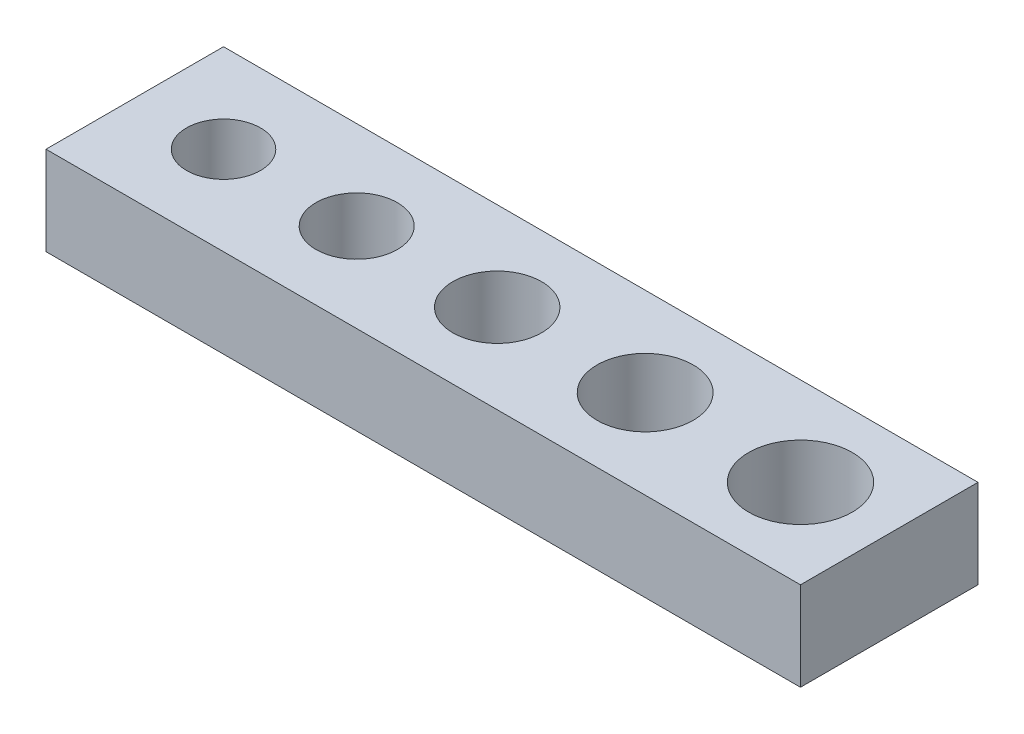
ISO-10303-21;
HEADER;
FILE_DESCRIPTION(('STEP AP214'),'2;1');
FILE_NAME('part.step','',(''),(''),'','','');
FILE_SCHEMA(('AUTOMOTIVE_DESIGN { 1 0 10303 214 1 1 1 1 }'));
ENDSEC;
DATA;
#1=APPLICATION_CONTEXT('core data for automotive mechanical design processes');
#2=APPLICATION_PROTOCOL_DEFINITION('international standard','automotive_design',2000,#1);
#3=PRODUCT_CONTEXT('',#1,'mechanical');
#4=PRODUCT('Part','Part','',(#3));
#5=PRODUCT_RELATED_PRODUCT_CATEGORY('part','',(#4));
#6=PRODUCT_DEFINITION_FORMATION('','',#4);
#7=PRODUCT_DEFINITION_CONTEXT('part definition',#1,'design');
#8=PRODUCT_DEFINITION('design','',#6,#7);
#9=PRODUCT_DEFINITION_SHAPE('','',#8);
#10=(LENGTH_UNIT() NAMED_UNIT(*) SI_UNIT(.MILLI.,.METRE.));
#11=(NAMED_UNIT(*) PLANE_ANGLE_UNIT() SI_UNIT($,.RADIAN.));
#12=(NAMED_UNIT(*) SI_UNIT($,.STERADIAN.) SOLID_ANGLE_UNIT());
#13=UNCERTAINTY_MEASURE_WITH_UNIT(LENGTH_MEASURE(1.E-05),#10,'distance_accuracy_value','');
#14=(GEOMETRIC_REPRESENTATION_CONTEXT(3) GLOBAL_UNCERTAINTY_ASSIGNED_CONTEXT((#13)) GLOBAL_UNIT_ASSIGNED_CONTEXT((#10,
#11,#12)) REPRESENTATION_CONTEXT('',''));
#15=CARTESIAN_POINT('',(0.,0.,0.));
#16=DIRECTION('',(0.,0.,1.));
#17=DIRECTION('',(1.,0.,0.));
#18=AXIS2_PLACEMENT_3D('',#15,#16,#17);
#19=CARTESIAN_POINT('',(0.,3.,0.));
#20=DIRECTION('',(0.,1.,0.));
#21=DIRECTION('',(0.,0.,1.));
#22=AXIS2_PLACEMENT_3D('',#19,#20,#21);
#23=PLANE('',#22);
#24=CARTESIAN_POINT('',(-15.,3.,0.));
#25=DIRECTION('',(0.,1.,0.));
#26=DIRECTION('',(0.,0.,1.));
#27=AXIS2_PLACEMENT_3D('',#24,#25,#26);
#28=CIRCLE('',#27,1.375);
#29=CARTESIAN_POINT('',(-15.,3.,1.375));
#30=VERTEX_POINT('',#29);
#31=EDGE_CURVE('E127',#30,#30,#28,.T.);
#32=ORIENTED_EDGE('',*,*,#31,.F.);
#33=EDGE_LOOP('',(#32));
#34=FACE_BOUND('',#33,.T.);
#35=CARTESIAN_POINT('',(-10.25,3.,0.));
#36=DIRECTION('',(0.,1.,0.));
#37=DIRECTION('',(0.,0.,1.));
#38=AXIS2_PLACEMENT_3D('',#35,#36,#37);
#39=CIRCLE('',#38,1.5);
#40=CARTESIAN_POINT('',(-10.25,3.,1.5));
#41=VERTEX_POINT('',#40);
#42=EDGE_CURVE('E115',#41,#41,#39,.T.);
#43=ORIENTED_EDGE('',*,*,#42,.F.);
#44=EDGE_LOOP('',(#43));
#45=FACE_BOUND('',#44,.T.);
#46=DIRECTION('',(0.,0.,-1.));
#47=VECTOR('',#46,1.);
#48=CARTESIAN_POINT('',(3.,3.,-3.));
#49=LINE('',#48,#47);
#50=CARTESIAN_POINT('',(3.,3.,3.));
#51=VERTEX_POINT('',#50);
#52=CARTESIAN_POINT('',(3.,3.,-3.));
#53=VERTEX_POINT('',#52);
#54=EDGE_CURVE('E85',#51,#53,#49,.T.);
#55=ORIENTED_EDGE('',*,*,#54,.T.);
#56=DIRECTION('',(-1.,0.,0.));
#57=VECTOR('',#56,1.);
#58=CARTESIAN_POINT('',(-22.5000000000001,3.,-3.));
#59=LINE('',#58,#57);
#60=CARTESIAN_POINT('',(-22.5000000000001,3.,-3.));
#61=VERTEX_POINT('',#60);
#62=EDGE_CURVE('E80',#53,#61,#59,.T.);
#63=ORIENTED_EDGE('',*,*,#62,.T.);
#64=DIRECTION('',(0.,0.,1.));
#65=VECTOR('',#64,1.);
#66=CARTESIAN_POINT('',(-22.5000000000001,3.,-3.));
#67=LINE('',#66,#65);
#68=CARTESIAN_POINT('',(-22.5000000000001,3.,3.00000000000002));
#69=VERTEX_POINT('',#68);
#70=EDGE_CURVE('E83',#61,#69,#67,.T.);
#71=ORIENTED_EDGE('',*,*,#70,.T.);
#72=DIRECTION('',(1.,0.,0.));
#73=VECTOR('',#72,1.);
#74=CARTESIAN_POINT('',(-22.5000000000001,3.,3.00000000000002));
#75=LINE('',#74,#73);
#76=EDGE_CURVE('E50',#69,#51,#75,.T.);
#77=ORIENTED_EDGE('',*,*,#76,.T.);
#78=EDGE_LOOP('',(#55,#63,#71,#77));
#79=FACE_BOUND('',#78,.T.);
#80=CARTESIAN_POINT('',(-19.5,3.,0.));
#81=DIRECTION('',(0.,1.,0.));
#82=DIRECTION('',(0.,0.,1.));
#83=AXIS2_PLACEMENT_3D('',#80,#81,#82);
#84=CIRCLE('',#83,1.25);
#85=CARTESIAN_POINT('',(-19.5,3.,1.25));
#86=VERTEX_POINT('',#85);
#87=EDGE_CURVE('E100',#86,#86,#84,.T.);
#88=ORIENTED_EDGE('',*,*,#87,.F.);
#89=EDGE_LOOP('',(#88));
#90=FACE_BOUND('',#89,.T.);
#91=CARTESIAN_POINT('',(-5.25,3.,0.));
#92=DIRECTION('',(0.,1.,0.));
#93=DIRECTION('',(0.,0.,1.));
#94=AXIS2_PLACEMENT_3D('',#91,#92,#93);
#95=CIRCLE('',#94,1.625);
#96=CARTESIAN_POINT('',(-5.25,3.,1.625));
#97=VERTEX_POINT('',#96);
#98=EDGE_CURVE('E121',#97,#97,#95,.T.);
#99=ORIENTED_EDGE('',*,*,#98,.F.);
#100=EDGE_LOOP('',(#99));
#101=FACE_BOUND('',#100,.T.);
#102=CARTESIAN_POINT('',(0.,3.,0.));
#103=DIRECTION('',(0.,1.,0.));
#104=DIRECTION('',(0.,0.,1.));
#105=AXIS2_PLACEMENT_3D('',#102,#103,#104);
#106=CIRCLE('',#105,1.75);
#107=CARTESIAN_POINT('',(0.,3.,1.75));
#108=VERTEX_POINT('',#107);
#109=EDGE_CURVE('E133',#108,#108,#106,.T.);
#110=ORIENTED_EDGE('',*,*,#109,.F.);
#111=EDGE_LOOP('',(#110));
#112=FACE_BOUND('',#111,.T.);
#113=ADVANCED_FACE('F33',(#34,#45,#79,#90,#101,#112),#23,.T.);
#114=CARTESIAN_POINT('',(0.,0.,0.));
#115=DIRECTION('',(0.,1.,0.));
#116=DIRECTION('',(0.,0.,1.));
#117=AXIS2_PLACEMENT_3D('',#114,#115,#116);
#118=PLANE('',#117);
#119=DIRECTION('',(0.,0.,-1.));
#120=VECTOR('',#119,1.);
#121=CARTESIAN_POINT('',(3.,0.,-3.));
#122=LINE('',#121,#120);
#123=CARTESIAN_POINT('',(3.,0.,3.));
#124=VERTEX_POINT('',#123);
#125=CARTESIAN_POINT('',(3.,0.,-3.));
#126=VERTEX_POINT('',#125);
#127=EDGE_CURVE('E97',#124,#126,#122,.T.);
#128=ORIENTED_EDGE('',*,*,#127,.F.);
#129=DIRECTION('',(1.,0.,0.));
#130=VECTOR('',#129,1.);
#131=CARTESIAN_POINT('',(-22.5000000000001,0.,3.00000000000002));
#132=LINE('',#131,#130);
#133=CARTESIAN_POINT('',(-22.5000000000001,0.,3.00000000000002));
#134=VERTEX_POINT('',#133);
#135=EDGE_CURVE('E73',#134,#124,#132,.T.);
#136=ORIENTED_EDGE('',*,*,#135,.F.);
#137=DIRECTION('',(0.,0.,1.));
#138=VECTOR('',#137,1.);
#139=CARTESIAN_POINT('',(-22.5000000000001,0.,-3.));
#140=LINE('',#139,#138);
#141=CARTESIAN_POINT('',(-22.5000000000001,0.,-3.));
#142=VERTEX_POINT('',#141);
#143=EDGE_CURVE('E67',#142,#134,#140,.T.);
#144=ORIENTED_EDGE('',*,*,#143,.F.);
#145=DIRECTION('',(-1.,0.,0.));
#146=VECTOR('',#145,1.);
#147=CARTESIAN_POINT('',(-22.5000000000001,0.,-3.));
#148=LINE('',#147,#146);
#149=EDGE_CURVE('E89',#126,#142,#148,.T.);
#150=ORIENTED_EDGE('',*,*,#149,.F.);
#151=EDGE_LOOP('',(#128,#136,#144,#150));
#152=FACE_BOUND('',#151,.T.);
#153=CARTESIAN_POINT('',(-19.5,0.,0.));
#154=DIRECTION('',(0.,1.,0.));
#155=DIRECTION('',(0.,0.,1.));
#156=AXIS2_PLACEMENT_3D('',#153,#154,#155);
#157=CIRCLE('',#156,1.25);
#158=CARTESIAN_POINT('',(-19.5,0.,1.25));
#159=VERTEX_POINT('',#158);
#160=EDGE_CURVE('E112',#159,#159,#157,.T.);
#161=ORIENTED_EDGE('',*,*,#160,.T.);
#162=EDGE_LOOP('',(#161));
#163=FACE_BOUND('',#162,.T.);
#164=CARTESIAN_POINT('',(-10.25,0.,0.));
#165=DIRECTION('',(0.,1.,0.));
#166=DIRECTION('',(0.,0.,1.));
#167=AXIS2_PLACEMENT_3D('',#164,#165,#166);
#168=CIRCLE('',#167,1.5);
#169=CARTESIAN_POINT('',(-10.25,0.,1.5));
#170=VERTEX_POINT('',#169);
#171=EDGE_CURVE('E118',#170,#170,#168,.T.);
#172=ORIENTED_EDGE('',*,*,#171,.T.);
#173=EDGE_LOOP('',(#172));
#174=FACE_BOUND('',#173,.T.);
#175=CARTESIAN_POINT('',(-5.25,0.,0.));
#176=DIRECTION('',(0.,1.,0.));
#177=DIRECTION('',(0.,0.,1.));
#178=AXIS2_PLACEMENT_3D('',#175,#176,#177);
#179=CIRCLE('',#178,1.625);
#180=CARTESIAN_POINT('',(-5.25,0.,1.625));
#181=VERTEX_POINT('',#180);
#182=EDGE_CURVE('E124',#181,#181,#179,.T.);
#183=ORIENTED_EDGE('',*,*,#182,.T.);
#184=EDGE_LOOP('',(#183));
#185=FACE_BOUND('',#184,.T.);
#186=CARTESIAN_POINT('',(-15.,0.,0.));
#187=DIRECTION('',(0.,1.,0.));
#188=DIRECTION('',(0.,0.,1.));
#189=AXIS2_PLACEMENT_3D('',#186,#187,#188);
#190=CIRCLE('',#189,1.375);
#191=CARTESIAN_POINT('',(-15.,0.,1.375));
#192=VERTEX_POINT('',#191);
#193=EDGE_CURVE('E130',#192,#192,#190,.T.);
#194=ORIENTED_EDGE('',*,*,#193,.T.);
#195=EDGE_LOOP('',(#194));
#196=FACE_BOUND('',#195,.T.);
#197=CARTESIAN_POINT('',(0.,0.,0.));
#198=DIRECTION('',(0.,1.,0.));
#199=DIRECTION('',(0.,0.,1.));
#200=AXIS2_PLACEMENT_3D('',#197,#198,#199);
#201=CIRCLE('',#200,1.75);
#202=CARTESIAN_POINT('',(0.,0.,1.75));
#203=VERTEX_POINT('',#202);
#204=EDGE_CURVE('E136',#203,#203,#201,.T.);
#205=ORIENTED_EDGE('',*,*,#204,.T.);
#206=EDGE_LOOP('',(#205));
#207=FACE_BOUND('',#206,.T.);
#208=ADVANCED_FACE('F108',(#152,#163,#174,#185,#196,#207),#118,.F.);
#209=CARTESIAN_POINT('',(3.,3.,-3.));
#210=DIRECTION('',(-1.,0.,0.));
#211=DIRECTION('',(0.,0.,1.));
#212=AXIS2_PLACEMENT_3D('',#209,#210,#211);
#213=PLANE('',#212);
#214=ORIENTED_EDGE('',*,*,#127,.T.);
#215=DIRECTION('',(0.,-1.,0.));
#216=VECTOR('',#215,1.);
#217=CARTESIAN_POINT('',(3.,3.,-3.));
#218=LINE('',#217,#216);
#219=EDGE_CURVE('E11',#53,#126,#218,.T.);
#220=ORIENTED_EDGE('',*,*,#219,.F.);
#221=ORIENTED_EDGE('',*,*,#54,.F.);
#222=DIRECTION('',(0.,-1.,0.));
#223=VECTOR('',#222,1.);
#224=CARTESIAN_POINT('',(3.,3.,3.));
#225=LINE('',#224,#223);
#226=EDGE_CURVE('E93',#51,#124,#225,.T.);
#227=ORIENTED_EDGE('',*,*,#226,.T.);
#228=EDGE_LOOP('',(#214,#220,#221,#227));
#229=FACE_BOUND('',#228,.T.);
#230=ADVANCED_FACE('F35',(#229),#213,.F.);
#231=CARTESIAN_POINT('',(-22.5000000000001,3.,-3.));
#232=DIRECTION('',(0.,0.,1.));
#233=DIRECTION('',(1.,0.,0.));
#234=AXIS2_PLACEMENT_3D('',#231,#232,#233);
#235=PLANE('',#234);
#236=ORIENTED_EDGE('',*,*,#149,.T.);
#237=DIRECTION('',(0.,-1.,0.));
#238=VECTOR('',#237,1.);
#239=CARTESIAN_POINT('',(-22.5000000000001,3.,-3.));
#240=LINE('',#239,#238);
#241=EDGE_CURVE('E42',#61,#142,#240,.T.);
#242=ORIENTED_EDGE('',*,*,#241,.F.);
#243=ORIENTED_EDGE('',*,*,#62,.F.);
#244=ORIENTED_EDGE('',*,*,#219,.T.);
#245=EDGE_LOOP('',(#236,#242,#243,#244));
#246=FACE_BOUND('',#245,.T.);
#247=ADVANCED_FACE('F88',(#246),#235,.F.);
#248=CARTESIAN_POINT('',(-22.5000000000001,3.,-3.));
#249=DIRECTION('',(1.,0.,0.));
#250=DIRECTION('',(0.,0.,-1.));
#251=AXIS2_PLACEMENT_3D('',#248,#249,#250);
#252=PLANE('',#251);
#253=ORIENTED_EDGE('',*,*,#143,.T.);
#254=DIRECTION('',(0.,-1.,0.));
#255=VECTOR('',#254,1.);
#256=CARTESIAN_POINT('',(-22.5000000000001,3.,3.00000000000002));
#257=LINE('',#256,#255);
#258=EDGE_CURVE('E90',#69,#134,#257,.T.);
#259=ORIENTED_EDGE('',*,*,#258,.F.);
#260=ORIENTED_EDGE('',*,*,#70,.F.);
#261=ORIENTED_EDGE('',*,*,#241,.T.);
#262=EDGE_LOOP('',(#253,#259,#260,#261));
#263=FACE_BOUND('',#262,.T.);
#264=ADVANCED_FACE('F91',(#263),#252,.F.);
#265=CARTESIAN_POINT('',(-22.5000000000001,3.,3.00000000000002));
#266=DIRECTION('',(0.,0.,-1.));
#267=DIRECTION('',(-1.,0.,0.));
#268=AXIS2_PLACEMENT_3D('',#265,#266,#267);
#269=PLANE('',#268);
#270=ORIENTED_EDGE('',*,*,#135,.T.);
#271=ORIENTED_EDGE('',*,*,#226,.F.);
#272=ORIENTED_EDGE('',*,*,#76,.F.);
#273=ORIENTED_EDGE('',*,*,#258,.T.);
#274=EDGE_LOOP('',(#270,#271,#272,#273));
#275=FACE_BOUND('',#274,.T.);
#276=ADVANCED_FACE('F105',(#275),#269,.F.);
#277=CARTESIAN_POINT('',(-19.5,3.,0.));
#278=DIRECTION('',(0.,-1.,0.));
#279=DIRECTION('',(0.,0.,-1.));
#280=AXIS2_PLACEMENT_3D('',#277,#278,#279);
#281=CYLINDRICAL_SURFACE('',#280,1.25);
#282=ORIENTED_EDGE('',*,*,#87,.T.);
#283=EDGE_LOOP('',(#282));
#284=FACE_BOUND('',#283,.T.);
#285=ORIENTED_EDGE('',*,*,#160,.F.);
#286=EDGE_LOOP('',(#285));
#287=FACE_BOUND('',#286,.T.);
#288=ADVANCED_FACE('F155',(#284,#287),#281,.F.);
#289=CARTESIAN_POINT('',(-10.25,3.,0.));
#290=DIRECTION('',(0.,-1.,0.));
#291=DIRECTION('',(0.,0.,-1.));
#292=AXIS2_PLACEMENT_3D('',#289,#290,#291);
#293=CYLINDRICAL_SURFACE('',#292,1.5);
#294=ORIENTED_EDGE('',*,*,#42,.T.);
#295=EDGE_LOOP('',(#294));
#296=FACE_BOUND('',#295,.T.);
#297=ORIENTED_EDGE('',*,*,#171,.F.);
#298=EDGE_LOOP('',(#297));
#299=FACE_BOUND('',#298,.T.);
#300=ADVANCED_FACE('F201',(#296,#299),#293,.F.);
#301=CARTESIAN_POINT('',(-5.25,3.,0.));
#302=DIRECTION('',(0.,-1.,0.));
#303=DIRECTION('',(0.,0.,-1.));
#304=AXIS2_PLACEMENT_3D('',#301,#302,#303);
#305=CYLINDRICAL_SURFACE('',#304,1.625);
#306=ORIENTED_EDGE('',*,*,#98,.T.);
#307=EDGE_LOOP('',(#306));
#308=FACE_BOUND('',#307,.T.);
#309=ORIENTED_EDGE('',*,*,#182,.F.);
#310=EDGE_LOOP('',(#309));
#311=FACE_BOUND('',#310,.T.);
#312=ADVANCED_FACE('F209',(#308,#311),#305,.F.);
#313=CARTESIAN_POINT('',(-15.,3.,0.));
#314=DIRECTION('',(0.,-1.,0.));
#315=DIRECTION('',(0.,0.,-1.));
#316=AXIS2_PLACEMENT_3D('',#313,#314,#315);
#317=CYLINDRICAL_SURFACE('',#316,1.375);
#318=ORIENTED_EDGE('',*,*,#31,.T.);
#319=EDGE_LOOP('',(#318));
#320=FACE_BOUND('',#319,.T.);
#321=ORIENTED_EDGE('',*,*,#193,.F.);
#322=EDGE_LOOP('',(#321));
#323=FACE_BOUND('',#322,.T.);
#324=ADVANCED_FACE('F217',(#320,#323),#317,.F.);
#325=CARTESIAN_POINT('',(0.,3.,0.));
#326=DIRECTION('',(0.,-1.,0.));
#327=DIRECTION('',(0.,0.,-1.));
#328=AXIS2_PLACEMENT_3D('',#325,#326,#327);
#329=CYLINDRICAL_SURFACE('',#328,1.75);
#330=ORIENTED_EDGE('',*,*,#109,.T.);
#331=EDGE_LOOP('',(#330));
#332=FACE_BOUND('',#331,.T.);
#333=ORIENTED_EDGE('',*,*,#204,.F.);
#334=EDGE_LOOP('',(#333));
#335=FACE_BOUND('',#334,.T.);
#336=ADVANCED_FACE('F142',(#332,#335),#329,.F.);
#337=CLOSED_SHELL('',(#113,#208,#230,#247,#264,#276,#288,#300,#312,#324,#336));
#338=MANIFOLD_SOLID_BREP('B2',#337);
#339=ADVANCED_BREP_SHAPE_REPRESENTATION('',(#18,#338),#14);
#340=SHAPE_DEFINITION_REPRESENTATION(#9,#339);
ENDSEC;
END-ISO-10303-21;
